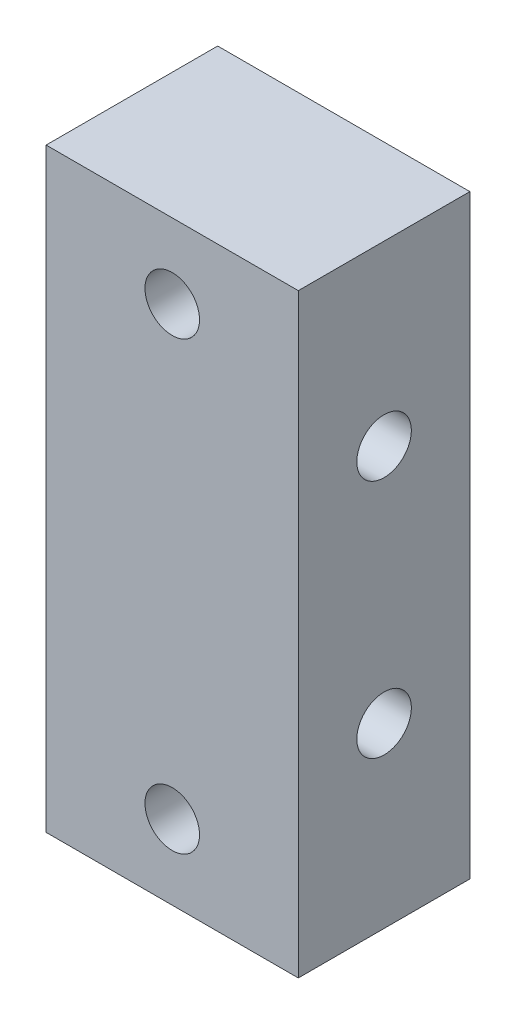
ISO-10303-21;
HEADER;
FILE_DESCRIPTION(('STEP AP214'),'2;1');
FILE_NAME('part.step','',(''),(''),'','','');
FILE_SCHEMA(('AUTOMOTIVE_DESIGN { 1 0 10303 214 1 1 1 1 }'));
ENDSEC;
DATA;
#1=APPLICATION_CONTEXT('core data for automotive mechanical design processes');
#2=APPLICATION_PROTOCOL_DEFINITION('international standard','automotive_design',2000,#1);
#3=PRODUCT_CONTEXT('',#1,'mechanical');
#4=PRODUCT('Part','Part','',(#3));
#5=PRODUCT_RELATED_PRODUCT_CATEGORY('part','',(#4));
#6=PRODUCT_DEFINITION_FORMATION('','',#4);
#7=PRODUCT_DEFINITION_CONTEXT('part definition',#1,'design');
#8=PRODUCT_DEFINITION('design','',#6,#7);
#9=PRODUCT_DEFINITION_SHAPE('','',#8);
#10=(LENGTH_UNIT() NAMED_UNIT(*) SI_UNIT(.MILLI.,.METRE.));
#11=(NAMED_UNIT(*) PLANE_ANGLE_UNIT() SI_UNIT($,.RADIAN.));
#12=(NAMED_UNIT(*) SI_UNIT($,.STERADIAN.) SOLID_ANGLE_UNIT());
#13=UNCERTAINTY_MEASURE_WITH_UNIT(LENGTH_MEASURE(1.E-05),#10,'distance_accuracy_value','');
#14=(GEOMETRIC_REPRESENTATION_CONTEXT(3) GLOBAL_UNCERTAINTY_ASSIGNED_CONTEXT((#13)) GLOBAL_UNIT_ASSIGNED_CONTEXT((#10,
#11,#12)) REPRESENTATION_CONTEXT('',''));
#15=CARTESIAN_POINT('',(0.,0.,0.));
#16=DIRECTION('',(0.,0.,1.));
#17=DIRECTION('',(1.,0.,0.));
#18=AXIS2_PLACEMENT_3D('',#15,#16,#17);
#19=CARTESIAN_POINT('',(9.3345,22.0345,12.7));
#20=DIRECTION('',(-1.,0.,0.));
#21=DIRECTION('',(0.,-1.,0.));
#22=AXIS2_PLACEMENT_3D('',#19,#20,#21);
#23=PLANE('',#22);
#24=CARTESIAN_POINT('',(9.3345,8.89,6.35));
#25=DIRECTION('',(1.,0.,0.));
#26=DIRECTION('',(0.,0.,-1.));
#27=AXIS2_PLACEMENT_3D('',#24,#25,#26);
#28=CIRCLE('',#27,2.0193);
#29=CARTESIAN_POINT('',(9.3345,8.89,4.3307));
#30=VERTEX_POINT('',#29);
#31=EDGE_CURVE('E116',#30,#30,#28,.T.);
#32=ORIENTED_EDGE('',*,*,#31,.F.);
#33=EDGE_LOOP('',(#32));
#34=FACE_BOUND('',#33,.T.);
#35=CARTESIAN_POINT('',(9.3345,-8.89,6.35));
#36=DIRECTION('',(1.,0.,0.));
#37=DIRECTION('',(0.,0.,-1.));
#38=AXIS2_PLACEMENT_3D('',#35,#36,#37);
#39=CIRCLE('',#38,2.0193);
#40=CARTESIAN_POINT('',(9.3345,-8.89,4.3307));
#41=VERTEX_POINT('',#40);
#42=EDGE_CURVE('E122',#41,#41,#39,.T.);
#43=ORIENTED_EDGE('',*,*,#42,.F.);
#44=EDGE_LOOP('',(#43));
#45=FACE_BOUND('',#44,.T.);
#46=DIRECTION('',(0.,1.,0.));
#47=VECTOR('',#46,1.);
#48=CARTESIAN_POINT('',(9.3345,22.0345,0.));
#49=LINE('',#48,#47);
#50=CARTESIAN_POINT('',(9.3345,-22.0345,0.));
#51=VERTEX_POINT('',#50);
#52=CARTESIAN_POINT('',(9.3345,22.0345,0.));
#53=VERTEX_POINT('',#52);
#54=EDGE_CURVE('E128',#51,#53,#49,.T.);
#55=ORIENTED_EDGE('',*,*,#54,.T.);
#56=DIRECTION('',(0.,0.,-1.));
#57=VECTOR('',#56,1.);
#58=CARTESIAN_POINT('',(9.3345,22.0345,12.7));
#59=LINE('',#58,#57);
#60=CARTESIAN_POINT('',(9.3345,22.0345,12.7));
#61=VERTEX_POINT('',#60);
#62=EDGE_CURVE('E11',#61,#53,#59,.T.);
#63=ORIENTED_EDGE('',*,*,#62,.F.);
#64=DIRECTION('',(0.,1.,0.));
#65=VECTOR('',#64,1.);
#66=CARTESIAN_POINT('',(9.3345,22.0345,12.7));
#67=LINE('',#66,#65);
#68=CARTESIAN_POINT('',(9.3345,-22.0345,12.7));
#69=VERTEX_POINT('',#68);
#70=EDGE_CURVE('E129',#69,#61,#67,.T.);
#71=ORIENTED_EDGE('',*,*,#70,.F.);
#72=DIRECTION('',(0.,0.,-1.));
#73=VECTOR('',#72,1.);
#74=CARTESIAN_POINT('',(9.3345,-22.0345,12.7));
#75=LINE('',#74,#73);
#76=EDGE_CURVE('E135',#69,#51,#75,.T.);
#77=ORIENTED_EDGE('',*,*,#76,.T.);
#78=EDGE_LOOP('',(#55,#63,#71,#77));
#79=FACE_BOUND('',#78,.T.);
#80=ADVANCED_FACE('F41',(#34,#45,#79),#23,.F.);
#81=CARTESIAN_POINT('',(-9.3345,22.0345,12.7));
#82=DIRECTION('',(0.,-1.,0.));
#83=DIRECTION('',(0.,0.,-1.));
#84=AXIS2_PLACEMENT_3D('',#81,#82,#83);
#85=PLANE('',#84);
#86=DIRECTION('',(-1.,0.,0.));
#87=VECTOR('',#86,1.);
#88=CARTESIAN_POINT('',(-9.3345,22.0345,0.));
#89=LINE('',#88,#87);
#90=CARTESIAN_POINT('',(-9.3345,22.0345,0.));
#91=VERTEX_POINT('',#90);
#92=EDGE_CURVE('E138',#53,#91,#89,.T.);
#93=ORIENTED_EDGE('',*,*,#92,.T.);
#94=DIRECTION('',(0.,0.,-1.));
#95=VECTOR('',#94,1.);
#96=CARTESIAN_POINT('',(-9.3345,22.0345,12.7));
#97=LINE('',#96,#95);
#98=CARTESIAN_POINT('',(-9.3345,22.0345,12.7));
#99=VERTEX_POINT('',#98);
#100=EDGE_CURVE('E49',#99,#91,#97,.T.);
#101=ORIENTED_EDGE('',*,*,#100,.F.);
#102=DIRECTION('',(-1.,0.,0.));
#103=VECTOR('',#102,1.);
#104=CARTESIAN_POINT('',(-9.3345,22.0345,12.7));
#105=LINE('',#104,#103);
#106=EDGE_CURVE('E88',#61,#99,#105,.T.);
#107=ORIENTED_EDGE('',*,*,#106,.F.);
#108=ORIENTED_EDGE('',*,*,#62,.T.);
#109=EDGE_LOOP('',(#93,#101,#107,#108));
#110=FACE_BOUND('',#109,.T.);
#111=ADVANCED_FACE('F162',(#110),#85,.F.);
#112=CARTESIAN_POINT('',(-9.3345,22.0345,12.7));
#113=DIRECTION('',(1.,0.,0.));
#114=DIRECTION('',(0.,1.,0.));
#115=AXIS2_PLACEMENT_3D('',#112,#113,#114);
#116=PLANE('',#115);
#117=CARTESIAN_POINT('',(-9.3345,8.89,6.35));
#118=DIRECTION('',(1.,0.,0.));
#119=DIRECTION('',(0.,0.,-1.));
#120=AXIS2_PLACEMENT_3D('',#117,#118,#119);
#121=CIRCLE('',#120,2.0193);
#122=CARTESIAN_POINT('',(-9.3345,8.89,4.3307));
#123=VERTEX_POINT('',#122);
#124=EDGE_CURVE('E119',#123,#123,#121,.T.);
#125=ORIENTED_EDGE('',*,*,#124,.T.);
#126=EDGE_LOOP('',(#125));
#127=FACE_BOUND('',#126,.T.);
#128=CARTESIAN_POINT('',(-9.3345,-8.89,6.35));
#129=DIRECTION('',(1.,0.,0.));
#130=DIRECTION('',(0.,0.,-1.));
#131=AXIS2_PLACEMENT_3D('',#128,#129,#130);
#132=CIRCLE('',#131,2.0193);
#133=CARTESIAN_POINT('',(-9.3345,-8.89,4.3307));
#134=VERTEX_POINT('',#133);
#135=EDGE_CURVE('E125',#134,#134,#132,.T.);
#136=ORIENTED_EDGE('',*,*,#135,.T.);
#137=EDGE_LOOP('',(#136));
#138=FACE_BOUND('',#137,.T.);
#139=DIRECTION('',(0.,-1.,0.));
#140=VECTOR('',#139,1.);
#141=CARTESIAN_POINT('',(-9.3345,22.0345,0.));
#142=LINE('',#141,#140);
#143=CARTESIAN_POINT('',(-9.33449999999999,-22.0345,0.));
#144=VERTEX_POINT('',#143);
#145=EDGE_CURVE('E75',#91,#144,#142,.T.);
#146=ORIENTED_EDGE('',*,*,#145,.T.);
#147=DIRECTION('',(0.,0.,-1.));
#148=VECTOR('',#147,1.);
#149=CARTESIAN_POINT('',(-9.33449999999999,-22.0345,12.7));
#150=LINE('',#149,#148);
#151=CARTESIAN_POINT('',(-9.33449999999999,-22.0345,12.7));
#152=VERTEX_POINT('',#151);
#153=EDGE_CURVE('E143',#152,#144,#150,.T.);
#154=ORIENTED_EDGE('',*,*,#153,.F.);
#155=DIRECTION('',(0.,-1.,0.));
#156=VECTOR('',#155,1.);
#157=CARTESIAN_POINT('',(-9.3345,22.0345,12.7));
#158=LINE('',#157,#156);
#159=EDGE_CURVE('E132',#99,#152,#158,.T.);
#160=ORIENTED_EDGE('',*,*,#159,.F.);
#161=ORIENTED_EDGE('',*,*,#100,.T.);
#162=EDGE_LOOP('',(#146,#154,#160,#161));
#163=FACE_BOUND('',#162,.T.);
#164=ADVANCED_FACE('F145',(#127,#138,#163),#116,.F.);
#165=CARTESIAN_POINT('',(-9.33449999999999,-22.0345,12.7));
#166=DIRECTION('',(0.,1.,0.));
#167=DIRECTION('',(0.,0.,1.));
#168=AXIS2_PLACEMENT_3D('',#165,#166,#167);
#169=PLANE('',#168);
#170=DIRECTION('',(1.,0.,0.));
#171=VECTOR('',#170,1.);
#172=CARTESIAN_POINT('',(-9.33449999999999,-22.0345,0.));
#173=LINE('',#172,#171);
#174=EDGE_CURVE('E81',#144,#51,#173,.T.);
#175=ORIENTED_EDGE('',*,*,#174,.T.);
#176=ORIENTED_EDGE('',*,*,#76,.F.);
#177=DIRECTION('',(1.,0.,0.));
#178=VECTOR('',#177,1.);
#179=CARTESIAN_POINT('',(-9.33449999999999,-22.0345,12.7));
#180=LINE('',#179,#178);
#181=EDGE_CURVE('E57',#152,#69,#180,.T.);
#182=ORIENTED_EDGE('',*,*,#181,.F.);
#183=ORIENTED_EDGE('',*,*,#153,.T.);
#184=EDGE_LOOP('',(#175,#176,#182,#183));
#185=FACE_BOUND('',#184,.T.);
#186=ADVANCED_FACE('F152',(#185),#169,.F.);
#187=CARTESIAN_POINT('',(0.,0.,12.7));
#188=DIRECTION('',(0.,0.,1.));
#189=DIRECTION('',(1.,0.,0.));
#190=AXIS2_PLACEMENT_3D('',#187,#188,#189);
#191=PLANE('',#190);
#192=CARTESIAN_POINT('',(0.,16.51,12.7));
#193=DIRECTION('',(0.,0.,1.));
#194=DIRECTION('',(1.,0.,0.));
#195=AXIS2_PLACEMENT_3D('',#192,#193,#194);
#196=CIRCLE('',#195,2.01929999999999);
#197=CARTESIAN_POINT('',(2.01929999999998,16.51,12.7));
#198=VERTEX_POINT('',#197);
#199=EDGE_CURVE('E106',#198,#198,#196,.T.);
#200=ORIENTED_EDGE('',*,*,#199,.F.);
#201=EDGE_LOOP('',(#200));
#202=FACE_BOUND('',#201,.T.);
#203=CARTESIAN_POINT('',(0.,-16.51,12.7));
#204=DIRECTION('',(0.,0.,1.));
#205=DIRECTION('',(1.,0.,0.));
#206=AXIS2_PLACEMENT_3D('',#203,#204,#205);
#207=CIRCLE('',#206,2.01929999999999);
#208=CARTESIAN_POINT('',(2.01929999999999,-16.51,12.7));
#209=VERTEX_POINT('',#208);
#210=EDGE_CURVE('E105',#209,#209,#207,.T.);
#211=ORIENTED_EDGE('',*,*,#210,.F.);
#212=EDGE_LOOP('',(#211));
#213=FACE_BOUND('',#212,.T.);
#214=ORIENTED_EDGE('',*,*,#70,.T.);
#215=ORIENTED_EDGE('',*,*,#106,.T.);
#216=ORIENTED_EDGE('',*,*,#159,.T.);
#217=ORIENTED_EDGE('',*,*,#181,.T.);
#218=EDGE_LOOP('',(#214,#215,#216,#217));
#219=FACE_BOUND('',#218,.T.);
#220=ADVANCED_FACE('F154',(#202,#213,#219),#191,.T.);
#221=CARTESIAN_POINT('',(0.,0.,0.));
#222=DIRECTION('',(0.,0.,1.));
#223=DIRECTION('',(1.,0.,0.));
#224=AXIS2_PLACEMENT_3D('',#221,#222,#223);
#225=PLANE('',#224);
#226=ORIENTED_EDGE('',*,*,#54,.F.);
#227=ORIENTED_EDGE('',*,*,#174,.F.);
#228=ORIENTED_EDGE('',*,*,#145,.F.);
#229=ORIENTED_EDGE('',*,*,#92,.F.);
#230=EDGE_LOOP('',(#226,#227,#228,#229));
#231=FACE_BOUND('',#230,.T.);
#232=ADVANCED_FACE('F148',(#231),#225,.F.);
#233=CARTESIAN_POINT('',(9.3345,-8.89,6.35));
#234=DIRECTION('',(1.,0.,0.));
#235=DIRECTION('',(0.,0.,-1.));
#236=AXIS2_PLACEMENT_3D('',#233,#234,#235);
#237=CYLINDRICAL_SURFACE('',#236,2.0193);
#238=ORIENTED_EDGE('',*,*,#135,.F.);
#239=EDGE_LOOP('',(#238));
#240=FACE_BOUND('',#239,.T.);
#241=ORIENTED_EDGE('',*,*,#42,.T.);
#242=EDGE_LOOP('',(#241));
#243=FACE_BOUND('',#242,.T.);
#244=ADVANCED_FACE('F175',(#240,#243),#237,.F.);
#245=CARTESIAN_POINT('',(9.3345,8.89,6.35));
#246=DIRECTION('',(1.,0.,0.));
#247=DIRECTION('',(0.,0.,-1.));
#248=AXIS2_PLACEMENT_3D('',#245,#246,#247);
#249=CYLINDRICAL_SURFACE('',#248,2.0193);
#250=ORIENTED_EDGE('',*,*,#124,.F.);
#251=EDGE_LOOP('',(#250));
#252=FACE_BOUND('',#251,.T.);
#253=ORIENTED_EDGE('',*,*,#31,.T.);
#254=EDGE_LOOP('',(#253));
#255=FACE_BOUND('',#254,.T.);
#256=ADVANCED_FACE('F177',(#252,#255),#249,.F.);
#257=CARTESIAN_POINT('',(0.,-16.51,6.35));
#258=DIRECTION('',(0.,0.,1.));
#259=DIRECTION('',(1.,0.,0.));
#260=AXIS2_PLACEMENT_3D('',#257,#258,#259);
#261=CONICAL_SURFACE('',#260,2.0193,1.02974425867665);
#262=CARTESIAN_POINT('',(0.,-16.51,5.13668215199765));
#263=VERTEX_POINT('',#262);
#264=VERTEX_LOOP('',#263);
#265=FACE_BOUND('',#264,.T.);
#266=CARTESIAN_POINT('',(0.,-16.51,6.35));
#267=DIRECTION('',(0.,0.,1.));
#268=DIRECTION('',(1.,0.,0.));
#269=AXIS2_PLACEMENT_3D('',#266,#267,#268);
#270=CIRCLE('',#269,2.0193);
#271=CARTESIAN_POINT('',(2.0193,-16.51,6.35));
#272=VERTEX_POINT('',#271);
#273=EDGE_CURVE('E109',#272,#272,#270,.T.);
#274=ORIENTED_EDGE('',*,*,#273,.T.);
#275=EDGE_LOOP('',(#274));
#276=FACE_BOUND('',#275,.T.);
#277=ADVANCED_FACE('F184',(#265,#276),#261,.F.);
#278=CARTESIAN_POINT('',(0.,-16.51,12.7));
#279=DIRECTION('',(0.,0.,1.));
#280=DIRECTION('',(1.,0.,0.));
#281=AXIS2_PLACEMENT_3D('',#278,#279,#280);
#282=CYLINDRICAL_SURFACE('',#281,2.01929999999999);
#283=ORIENTED_EDGE('',*,*,#273,.F.);
#284=EDGE_LOOP('',(#283));
#285=FACE_BOUND('',#284,.T.);
#286=ORIENTED_EDGE('',*,*,#210,.T.);
#287=EDGE_LOOP('',(#286));
#288=FACE_BOUND('',#287,.T.);
#289=ADVANCED_FACE('F99',(#285,#288),#282,.F.);
#290=CARTESIAN_POINT('',(0.,16.51,6.35));
#291=DIRECTION('',(0.,0.,1.));
#292=DIRECTION('',(1.,0.,0.));
#293=AXIS2_PLACEMENT_3D('',#290,#291,#292);
#294=CONICAL_SURFACE('',#293,2.0193,1.02974425867665);
#295=CARTESIAN_POINT('',(0.,16.51,5.13668215199765));
#296=VERTEX_POINT('',#295);
#297=VERTEX_LOOP('',#296);
#298=FACE_BOUND('',#297,.T.);
#299=CARTESIAN_POINT('',(0.,16.51,6.35));
#300=DIRECTION('',(0.,0.,1.));
#301=DIRECTION('',(1.,0.,0.));
#302=AXIS2_PLACEMENT_3D('',#299,#300,#301);
#303=CIRCLE('',#302,2.0193);
#304=CARTESIAN_POINT('',(2.01929999999999,16.51,6.35));
#305=VERTEX_POINT('',#304);
#306=EDGE_CURVE('E103',#305,#305,#303,.T.);
#307=ORIENTED_EDGE('',*,*,#306,.T.);
#308=EDGE_LOOP('',(#307));
#309=FACE_BOUND('',#308,.T.);
#310=ADVANCED_FACE('F95',(#298,#309),#294,.F.);
#311=CARTESIAN_POINT('',(0.,16.51,12.7));
#312=DIRECTION('',(0.,0.,1.));
#313=DIRECTION('',(1.,0.,0.));
#314=AXIS2_PLACEMENT_3D('',#311,#312,#313);
#315=CYLINDRICAL_SURFACE('',#314,2.01929999999999);
#316=ORIENTED_EDGE('',*,*,#306,.F.);
#317=EDGE_LOOP('',(#316));
#318=FACE_BOUND('',#317,.T.);
#319=ORIENTED_EDGE('',*,*,#199,.T.);
#320=EDGE_LOOP('',(#319));
#321=FACE_BOUND('',#320,.T.);
#322=ADVANCED_FACE('F98',(#318,#321),#315,.F.);
#323=CLOSED_SHELL('',(#80,#111,#164,#186,#220,#232,#244,#256,#277,#289,#310,#322));
#324=MANIFOLD_SOLID_BREP('B2',#323);
#325=ADVANCED_BREP_SHAPE_REPRESENTATION('',(#18,#324),#14);
#326=SHAPE_DEFINITION_REPRESENTATION(#9,#325);
ENDSEC;
END-ISO-10303-21;
